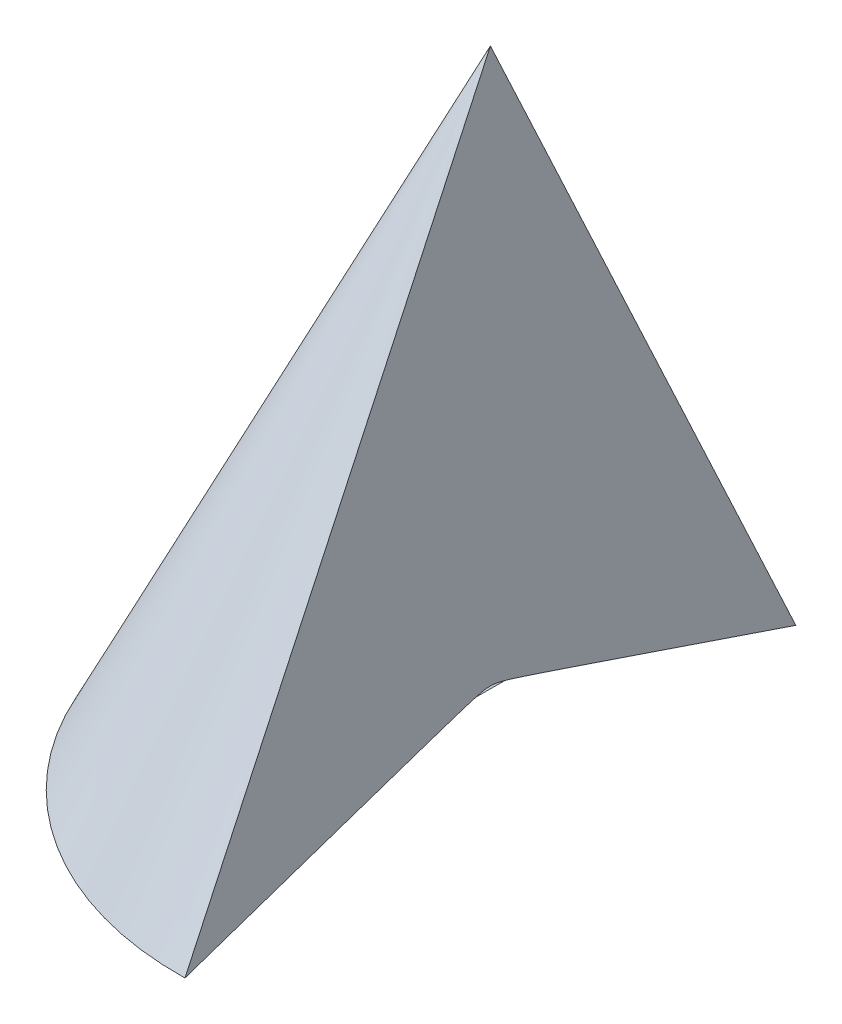
ISO-10303-21;
HEADER;
FILE_DESCRIPTION(('STEP AP214'),'2;1');
FILE_NAME('part.step','',(''),(''),'','','');
FILE_SCHEMA(('AUTOMOTIVE_DESIGN { 1 0 10303 214 1 1 1 1 }'));
ENDSEC;
DATA;
#1=APPLICATION_CONTEXT('core data for automotive mechanical design processes');
#2=APPLICATION_PROTOCOL_DEFINITION('international standard','automotive_design',2000,#1);
#3=PRODUCT_CONTEXT('',#1,'mechanical');
#4=PRODUCT('Part','Part','',(#3));
#5=PRODUCT_RELATED_PRODUCT_CATEGORY('part','',(#4));
#6=PRODUCT_DEFINITION_FORMATION('','',#4);
#7=PRODUCT_DEFINITION_CONTEXT('part definition',#1,'design');
#8=PRODUCT_DEFINITION('design','',#6,#7);
#9=PRODUCT_DEFINITION_SHAPE('','',#8);
#10=(LENGTH_UNIT() NAMED_UNIT(*) SI_UNIT(.MILLI.,.METRE.));
#11=(NAMED_UNIT(*) PLANE_ANGLE_UNIT() SI_UNIT($,.RADIAN.));
#12=(NAMED_UNIT(*) SI_UNIT($,.STERADIAN.) SOLID_ANGLE_UNIT());
#13=UNCERTAINTY_MEASURE_WITH_UNIT(LENGTH_MEASURE(1.E-05),#10,'distance_accuracy_value','');
#14=(GEOMETRIC_REPRESENTATION_CONTEXT(3) GLOBAL_UNCERTAINTY_ASSIGNED_CONTEXT((#13)) GLOBAL_UNIT_ASSIGNED_CONTEXT((#10,
#11,#12)) REPRESENTATION_CONTEXT('',''));
#15=CARTESIAN_POINT('',(0.,0.,0.));
#16=DIRECTION('',(0.,0.,1.));
#17=DIRECTION('',(1.,0.,0.));
#18=AXIS2_PLACEMENT_3D('',#15,#16,#17);
#19=CARTESIAN_POINT('',(-0.345388264296928,-18.896297547224,0.));
#20=DIRECTION('',(-0.0182750394746705,-0.999832997521186,0.));
#21=DIRECTION('',(0.999832997521186,-0.0182750394746705,0.));
#22=AXIS2_PLACEMENT_3D('',#19,#20,#21);
#23=CONICAL_SURFACE('',#22,55.7196314004557,1.24378548178926);
#24=CARTESIAN_POINT('',(0.,0.,0.));
#25=VERTEX_POINT('',#24);
#26=VERTEX_LOOP('',#25);
#27=FACE_BOUND('',#26,.T.);
#28=CARTESIAN_POINT('',(-0.345388264296928,-18.896297547224,0.));
#29=DIRECTION('',(-0.0182750394746705,-0.999832997521186,0.));
#30=DIRECTION('',(0.999832997521186,-0.0182750394746705,0.));
#31=AXIS2_PLACEMENT_3D('',#28,#29,#30);
#32=CIRCLE('',#31,55.7196314004557);
#33=CARTESIAN_POINT('',(1.8344866803659,-18.9361415019267,55.676960056091));
#34=VERTEX_POINT('',#33);
#35=CARTESIAN_POINT('',(1.8344866803659,-18.9361415019267,-55.676960056091));
#36=VERTEX_POINT('',#35);
#37=EDGE_CURVE('E59',#34,#36,#32,.T.);
#38=ORIENTED_EDGE('',*,*,#37,.T.);
#39=CARTESIAN_POINT('',(1.8344866803659,-57.3486806682432,-168.924511653932));
#40=CARTESIAN_POINT('',(1.8344866803659,-56.1488846711305,-165.387706260298));
#41=CARTESIAN_POINT('',(1.8344866803659,-54.9490924828589,-161.850899574579));
#42=CARTESIAN_POINT('',(1.8344866803659,-52.5494827497862,-154.777179475989));
#43=CARTESIAN_POINT('',(1.8344866803659,-51.3496652052696,-151.240266063022));
#44=CARTESIAN_POINT('',(1.8344866803659,-48.9431727661586,-144.146185585806));
#45=CARTESIAN_POINT('',(1.8344866803659,-47.7364979395491,-140.589018498495));
#46=CARTESIAN_POINT('',(1.8344866803659,-45.3231987305474,-133.474783641327));
#47=CARTESIAN_POINT('',(1.8344866803659,-44.1165743477142,-129.917715871619));
#48=CARTESIAN_POINT('',(1.8344866803659,-41.5992032850772,-122.496567514345));
#49=CARTESIAN_POINT('',(1.8344866803659,-40.2884583261761,-118.632486343021));
#50=CARTESIAN_POINT('',(1.8344866803659,-37.6668795245121,-110.903963293529));
#51=CARTESIAN_POINT('',(1.8344866803659,-36.3560456844723,-107.039521414438));
#52=CARTESIAN_POINT('',(1.8344866803659,-33.7421429339811,-99.3333939472332));
#53=CARTESIAN_POINT('',(1.8344866803659,-32.4390737809483,-95.4917084414033));
#54=CARTESIAN_POINT('',(1.8344866803659,-29.8334300657303,-87.8096056111936));
#55=CARTESIAN_POINT('',(1.8344866803659,-28.5308554841748,-83.9691882933841));
#56=CARTESIAN_POINT('',(1.8344866803659,-26.6457828258898,-78.411168852217));
#57=CARTESIAN_POINT('',(1.8344866803659,-26.0632500042988,-76.693578513027));
#58=CARTESIAN_POINT('',(1.8344866803659,-24.8982026043487,-73.2583811652422));
#59=CARTESIAN_POINT('',(1.8344866803659,-24.315688026107,-71.5407741566075));
#60=CARTESIAN_POINT('',(1.8344866803659,-23.1499807748147,-68.1034736927679));
#61=CARTESIAN_POINT('',(1.8344866803659,-22.5667881337742,-66.3837802267071));
#62=CARTESIAN_POINT('',(1.8344866803659,-21.4004479675787,-62.9444166415996));
#63=CARTESIAN_POINT('',(1.8344866803659,-20.8173004417513,-61.2247465227808));
#64=CARTESIAN_POINT('',(1.8344866803659,-19.6396227509247,-57.7516975838534));
#65=CARTESIAN_POINT('',(1.8344866803659,-19.0450934316333,-55.9983184769713));
#66=CARTESIAN_POINT('',(1.8344866803659,-17.8560483221721,-52.4914077001424));
#67=CARTESIAN_POINT('',(1.8344866803659,-17.2615325364327,-50.7378760286934));
#68=CARTESIAN_POINT('',(1.8344866803659,-16.0751587993582,-47.2383915945871));
#69=CARTESIAN_POINT('',(1.8344866803659,-15.4833005045609,-45.4924389483697));
#70=CARTESIAN_POINT('',(1.8344866803659,-14.2998610656257,-42.0009898062797));
#71=CARTESIAN_POINT('',(1.8344866803659,-13.7082798904323,-40.255493320934));
#72=CARTESIAN_POINT('',(1.8344866803659,-12.5605077070578,-36.8684075305115));
#73=CARTESIAN_POINT('',(1.8344866803659,-12.0043073981966,-35.2268213771852));
#74=CARTESIAN_POINT('',(1.8344866803659,-10.8915452322914,-31.9418834290317));
#75=CARTESIAN_POINT('',(1.8344866803659,-10.334983594303,-30.2985315599925));
#76=CARTESIAN_POINT('',(1.8344866803659,-9.4954419070454,-27.8187735139823));
#77=CARTESIAN_POINT('',(1.8344866803659,-9.21233429901166,-26.9824105239473));
#78=CARTESIAN_POINT('',(1.8344866803659,-8.64622282900986,-25.309600511561));
#79=CARTESIAN_POINT('',(1.8344866803659,-8.36321897326613,-24.4731534871032));
#80=CARTESIAN_POINT('',(1.8344866803659,-7.7984348369219,-22.8033509128362));
#81=CARTESIAN_POINT('',(1.8344866803659,-7.51665395704138,-21.9699955657342));
#82=CARTESIAN_POINT('',(1.8344866803659,-6.95336778078859,-20.3033736537516));
#83=CARTESIAN_POINT('',(1.8344866803659,-6.67186244123925,-19.470107103466));
#84=CARTESIAN_POINT('',(1.8344866803659,-6.12215032647128,-17.841905931166));
#85=CARTESIAN_POINT('',(1.8344866803659,-5.85392911075651,-17.0469761849158));
#86=CARTESIAN_POINT('',(1.8344866803659,-5.31772757410966,-15.4563991449005));
#87=CARTESIAN_POINT('',(1.8344866803659,-5.04974756483601,-14.6607517460274));
#88=CARTESIAN_POINT('',(1.8344866803659,-4.64627173815602,-13.4610662917757));
#89=CARTESIAN_POINT('',(1.8344866803659,-4.5105161859179,-13.0571155980092));
#90=CARTESIAN_POINT('',(1.8344866803659,-4.23924153686415,-12.2491267830978));
#91=CARTESIAN_POINT('',(1.8344866803659,-4.10372244431298,-11.8450886605209));
#92=CARTESIAN_POINT('',(1.8344866803659,-3.83336237329919,-11.0379749732396));
#93=CARTESIAN_POINT('',(1.8344866803659,-3.69852054940558,-10.6348996918121));
#94=CARTESIAN_POINT('',(1.8344866803659,-3.42928622379184,-9.8286289517244));
#95=CARTESIAN_POINT('',(1.8344866803659,-3.29489369267837,-9.42543350288273));
#96=CARTESIAN_POINT('',(1.8344866803659,-3.03248244453316,-8.63610240465802));
#97=CARTESIAN_POINT('',(1.8344866803659,-2.90443722764711,-8.24997557246096));
#98=CARTESIAN_POINT('',(1.8344866803659,-2.64917624742354,-7.47734186193978));
#99=CARTESIAN_POINT('',(1.8344866803659,-2.52196069693394,-7.09083491326735));
#100=CARTESIAN_POINT('',(1.8344866803659,-2.26757108668334,-6.31343109417491));
#101=CARTESIAN_POINT('',(1.8344866803659,-2.14041073454425,-5.92252972363981));
#102=CARTESIAN_POINT('',(1.8344866803659,-1.95148911154104,-5.33579043364415));
#103=CARTESIAN_POINT('',(1.8344866803659,-1.88884686142146,-5.14023641439325));
#104=CARTESIAN_POINT('',(1.8344866803659,-1.76436790082381,-4.74887240892809));
#105=CARTESIAN_POINT('',(1.8344866803659,-1.70253118795538,-4.55306242347529));
#106=CARTESIAN_POINT('',(1.8344866803659,-1.58213752519839,-4.16800034782879));
#107=CARTESIAN_POINT('',(1.8344866803659,-1.52354180118499,-3.97876040830553));
#108=CARTESIAN_POINT('',(1.8344866803659,-1.40783739844313,-3.5998289712902));
#109=CARTESIAN_POINT('',(1.8344866803659,-1.3507286924364,-3.41013748215125));
#110=CARTESIAN_POINT('',(1.8344866803659,-1.23849793104316,-3.02939614724901));
#111=CARTESIAN_POINT('',(1.8344866803659,-1.18338405488034,-2.83834387339489));
#112=CARTESIAN_POINT('',(1.8344866803659,-1.07657173643614,-2.45525921290713));
#113=CARTESIAN_POINT('',(1.8344866803659,-1.02487364858583,-2.2632267267842));
#114=CARTESIAN_POINT('',(1.8344866803659,-0.928031343347894,-1.88187080469717));
#115=CARTESIAN_POINT('',(1.8344866803659,-0.882770102757694,-1.69257790709622));
#116=CARTESIAN_POINT('',(1.8344866803659,-0.821453542421972,-1.40718759056024));
#117=CARTESIAN_POINT('',(1.8344866803659,-0.802108926077679,-1.31180580193573));
#118=CARTESIAN_POINT('',(1.8344866803659,-0.766248476397584,-1.12051840746296));
#119=CARTESIAN_POINT('',(1.8344866803659,-0.749732666605156,-1.02461279726193));
#120=CARTESIAN_POINT('',(1.8344866803659,-0.705794971790485,-0.737564509655973));
#121=CARTESIAN_POINT('',(1.8344866803659,-0.683622131817135,-0.545522516589417));
#122=CARTESIAN_POINT('',(1.8344866803659,-0.665092398140918,-0.256629299256788));
#123=CARTESIAN_POINT('',(1.8344866803659,-0.661369188193533,-0.160234620541625));
#124=CARTESIAN_POINT('',(1.8344866803659,-0.659100346061676,0.0326202567833365));
#125=CARTESIAN_POINT('',(1.8344866803659,-0.660554620024727,0.129080454173785));
#126=CARTESIAN_POINT('',(1.8344866803659,-0.668503307728492,0.321295579817073));
#127=CARTESIAN_POINT('',(1.8344866803659,-0.674972091148605,0.417051602150619));
#128=CARTESIAN_POINT('',(1.8344866803659,-0.692415156251004,0.608148551785522));
#129=CARTESIAN_POINT('',(1.8344866803659,-0.703389759523428,0.703489448967545));
#130=CARTESIAN_POINT('',(1.8344866803659,-0.742027805830815,0.988963818656927));
#131=CARTESIAN_POINT('',(1.8344866803659,-0.775392729325024,1.1783170540667));
#132=CARTESIAN_POINT('',(1.8344866803659,-0.852050547852075,1.55665767134898));
#133=CARTESIAN_POINT('',(1.8344866803659,-0.895430108928356,1.74562641610541));
#134=CARTESIAN_POINT('',(1.8344866803659,-0.988066085578386,2.12198178972957));
#135=CARTESIAN_POINT('',(1.8344866803659,-1.03731912444793,2.30936926195907));
#136=CARTESIAN_POINT('',(1.8344866803659,-1.14070199472914,2.68755781438007));
#137=CARTESIAN_POINT('',(1.8344866803659,-1.19491974834035,2.87833452801593));
#138=CARTESIAN_POINT('',(1.8344866803659,-1.30581501561996,3.25917383232224));
#139=CARTESIAN_POINT('',(1.8344866803659,-1.36249260450217,3.44923640096309));
#140=CARTESIAN_POINT('',(1.8344866803659,-1.47726640871431,3.82811804371395));
#141=CARTESIAN_POINT('',(1.8344866803659,-1.53535619797161,4.01693907252071));
#142=CARTESIAN_POINT('',(1.8344866803659,-1.65267367460009,4.39421948670965));
#143=CARTESIAN_POINT('',(1.8344866803659,-1.71190132352889,4.5826788840737));
#144=CARTESIAN_POINT('',(1.8344866803659,-1.89518929833138,5.16156594805983));
#145=CARTESIAN_POINT('',(1.8344866803659,-2.02057716783557,5.5515726540618));
#146=CARTESIAN_POINT('',(1.8344866803659,-2.27336611068459,6.33138164665254));
#147=CARTESIAN_POINT('',(1.8344866803659,-2.40076915636186,6.72118329054194));
#148=CARTESIAN_POINT('',(1.8344866803659,-2.6555050467717,7.49665303969533));
#149=CARTESIAN_POINT('',(1.8344866803659,-2.78282675464133,7.88232480486379));
#150=CARTESIAN_POINT('',(1.8344866803659,-3.03817544154164,8.65331320606043));
#151=CARTESIAN_POINT('',(1.8344866803659,-3.16620221050508,9.03862991175107));
#152=CARTESIAN_POINT('',(1.8344866803659,-3.42843333470726,9.82611380950976));
#153=CARTESIAN_POINT('',(1.8344866803659,-3.56266071341932,10.2282733322899));
#154=CARTESIAN_POINT('',(1.8344866803659,-3.83151890350913,11.0324919332948));
#155=CARTESIAN_POINT('',(1.8344866803659,-3.96614974521042,11.4345510013777));
#156=CARTESIAN_POINT('',(1.8344866803659,-4.37114233174841,12.6426022163903));
#157=CARTESIAN_POINT('',(1.8344866803659,-4.64193104945772,13.4484511971823));
#158=CARTESIAN_POINT('',(1.8344866803659,-5.18027954630628,15.0484002114153));
#159=CARTESIAN_POINT('',(1.8344866803659,-5.4478300820121,15.8425033574683));
#160=CARTESIAN_POINT('',(1.8344866803659,-5.98315495377473,17.4300295075399));
#161=CARTESIAN_POINT('',(1.8344866803659,-6.25092901171867,18.2234526053473));
#162=CARTESIAN_POINT('',(1.8344866803659,-6.7995569119737,19.8481321913233));
#163=CARTESIAN_POINT('',(1.8344866803659,-7.08042411312321,20.6793841675459));
#164=CARTESIAN_POINT('',(1.8344866803659,-7.64241937381272,22.3419728100714));
#165=CARTESIAN_POINT('',(1.8344866803659,-7.92354747225672,23.1733094632228));
#166=CARTESIAN_POINT('',(1.8344866803659,-8.48697041675699,24.8389356367379));
#167=CARTESIAN_POINT('',(1.8344866803659,-8.7692658081737,25.6732249726128));
#168=CARTESIAN_POINT('',(1.8344866803659,-9.33395554058288,27.3417236642291));
#169=CARTESIAN_POINT('',(1.8344866803659,-9.61634987592236,28.1759330218839));
#170=CARTESIAN_POINT('',(1.8344866803659,-10.1764103993795,29.8301023464428));
#171=CARTESIAN_POINT('',(1.8344866803659,-10.4540751266706,30.6500628079612));
#172=CARTESIAN_POINT('',(1.8344866803659,-11.009473969167,32.2899724071442));
#173=CARTESIAN_POINT('',(1.8344866803659,-11.2872080852474,33.1099215445124));
#174=CARTESIAN_POINT('',(1.8344866803659,-12.1199364474242,35.5681132108105));
#175=CARTESIAN_POINT('',(1.8344866803659,-12.6750084489587,37.2063293993698));
#176=CARTESIAN_POINT('',(1.8344866803659,-13.8201806075072,40.5856755579076));
#177=CARTESIAN_POINT('',(1.8344866803659,-14.4102896821467,42.3268025057739));
#178=CARTESIAN_POINT('',(1.8344866803659,-15.5907746990135,45.8094912886236));
#179=CARTESIAN_POINT('',(1.8344866803659,-16.1811506702429,47.5510531137763));
#180=CARTESIAN_POINT('',(1.8344866803659,-17.3644863221778,51.0415454308879));
#181=CARTESIAN_POINT('',(1.8344866803659,-17.9574463295974,52.7904758120834));
#182=CARTESIAN_POINT('',(1.8344866803659,-19.143380688944,56.2881904042923));
#183=CARTESIAN_POINT('',(1.8344866803659,-19.7363550367179,58.0369746167139));
#184=CARTESIAN_POINT('',(1.8344866803659,-20.9111252720089,61.5014338601668));
#185=CARTESIAN_POINT('',(1.8344866803659,-21.4929203425145,63.2171091682421));
#186=CARTESIAN_POINT('',(1.8344866803659,-22.6565545116233,66.6484817742215));
#187=CARTESIAN_POINT('',(1.8344866803659,-23.2383936108595,68.3641790719109));
#188=CARTESIAN_POINT('',(1.8344866803659,-24.4014130722239,71.7935454438034));
#189=CARTESIAN_POINT('',(1.8344866803659,-24.9825934036469,73.5072145284197));
#190=CARTESIAN_POINT('',(1.8344866803659,-26.1449721473881,76.9345365516576));
#191=CARTESIAN_POINT('',(1.8344866803659,-26.7261705595955,78.6481894903169));
#192=CARTESIAN_POINT('',(1.8344866803659,-28.6061277384183,84.1911178353617));
#193=CARTESIAN_POINT('',(1.8344866803659,-29.9049207431103,88.0203816294452));
#194=CARTESIAN_POINT('',(1.8344866803659,-32.5029880943351,95.6801407553441));
#195=CARTESIAN_POINT('',(1.8344866803659,-33.8022624595105,99.5106360808363));
#196=CARTESIAN_POINT('',(1.8344866803659,-36.4084427037084,107.193992688802));
#197=CARTESIAN_POINT('',(1.8344866803659,-37.7153488193245,111.046853891024));
#198=CARTESIAN_POINT('',(1.8344866803659,-40.3290753026697,118.752225733251));
#199=CARTESIAN_POINT('',(1.8344866803659,-41.6358956677706,122.604736374148));
#200=CARTESIAN_POINT('',(1.8344866803659,-44.146556212271,130.006101097389));
#201=CARTESIAN_POINT('',(1.8344866803659,-45.3503946979218,133.554955754279));
#202=CARTESIAN_POINT('',(1.8344866803659,-47.7581210371862,140.652761519382));
#203=CARTESIAN_POINT('',(1.8344866803659,-48.962008891227,144.201712627448));
#204=CARTESIAN_POINT('',(1.8344866803659,-51.3630390399814,151.279690511289));
#205=CARTESIAN_POINT('',(1.8344866803659,-52.5601812680292,154.808717309678));
#206=CARTESIAN_POINT('',(1.8344866803659,-54.9544412893901,161.866667052172));
#207=CARTESIAN_POINT('',(1.8344866803659,-56.1515590824273,165.39558999637));
#208=CARTESIAN_POINT('',(1.8344866803659,-57.3486806682432,168.924511653932));
#209=B_SPLINE_CURVE_WITH_KNOTS('',3,(#39,#40,#41,#42,#43,#44,#45,#46,#47,#48,#49,#50,#51,#52,
#53,#54,#55,#56,#57,#58,#59,#60,#61,#62,#63,#64,#65,#66,#67,#68,#69,#70,#71,#72,#73,#74,#75,#76,
#77,#78,#79,#80,#81,#82,#83,#84,#85,#86,#87,#88,#89,#90,#91,#92,#93,#94,#95,#96,#97,#98,#99,
#100,#101,#102,#103,#104,#105,#106,#107,#108,#109,#110,#111,#112,#113,#114,#115,#116,#117,#118,
#119,#120,#121,#122,#123,#124,#125,#126,#127,#128,#129,#130,#131,#132,#133,#134,#135,#136,#137,
#138,#139,#140,#141,#142,#143,#144,#145,#146,#147,#148,#149,#150,#151,#152,#153,#154,#155,#156,
#157,#158,#159,#160,#161,#162,#163,#164,#165,#166,#167,#168,#169,#170,#171,#172,#173,#174,#175,
#176,#177,#178,#179,#180,#181,#182,#183,#184,#185,#186,#187,#188,#189,#190,#191,#192,#193,#194,
#195,#196,#197,#198,#199,#200,#201,#202,#203,#204,#205,#206,#207,#208),.UNSPECIFIED.,.F.,.F.,(4,
2,2,2,2,2,2,2,2,2,2,2,2,2,2,2,2,2,2,2,2,2,2,2,2,2,2,2,2,2,2,2,2,2,2,2,2,2,2,2,2,2,2,2,2,2,2,2,2,
2,2,2,2,2,2,2,2,2,2,2,2,2,2,2,2,2,2,2,2,2,2,2,2,2,2,2,2,2,2,2,2,2,2,2,4),(0.,11.2043083429675,
22.4089443334072,33.6777293796037,44.9461836513727,57.1872040667914,69.4293349080006,
81.5993320601462,93.765249675312,99.2063111115041,104.647402328153,110.095074625666,
115.542637125101,121.096935517089,126.651654327681,132.182280144899,137.711343025765,
142.911100218687,148.116222283365,150.76516106832,153.414238870092,156.053355064108,
158.691954189768,161.208837774155,163.727530174964,165.005986845741,166.284466339509,
167.559561447736,168.834571437789,170.054982740271,171.275695704424,172.508882564825,
173.124908006525,173.740931619815,174.335239522365,174.929536515076,175.526043945182,
176.122613173562,176.706354451431,176.998284964928,177.290217907963,177.869265352082,
178.158541574994,178.44781255421,178.735614673147,179.023437336717,179.599777118485,
180.181304999976,180.762500154268,181.357471269737,181.952460590335,182.545119428843,
183.13775827957,184.366749494182,185.597028838193,186.81546165825,188.033549225411,
189.305454361493,190.577457617204,193.127843655953,195.641734524106,198.153906494901,
200.786167103157,203.418919017505,206.061184030923,208.703316935451,211.300410640965,
213.897538946055,219.086634701035,224.601865056111,230.118588030504,235.658735268983,
241.19848103755,246.633390916913,252.068405690533,257.497023450239,262.925612760144,
275.056198906079,287.190747716205,299.396192703723,311.600559108487,322.842995155737,
334.085752797544,345.265404711667,356.444738028465),.UNSPECIFIED.);
#210=EDGE_CURVE('E56',#36,#34,#209,.T.);
#211=ORIENTED_EDGE('',*,*,#210,.T.);
#212=EDGE_LOOP('',(#38,#211));
#213=FACE_BOUND('',#212,.T.);
#214=ADVANCED_FACE('F33',(#27,#213),#23,.F.);
#215=CARTESIAN_POINT('',(1.8344866803659,100.365327204088,0.));
#216=DIRECTION('',(-0.0182750394746705,-0.999832997521186,0.));
#217=DIRECTION('',(0.999832997521186,-0.0182750394746705,0.));
#218=AXIS2_PLACEMENT_3D('',#215,#216,#217);
#219=CONICAL_SURFACE('',#218,0.,0.437005111635416);
#220=DIRECTION('',(0.,0.906174578344793,-0.422903811240377));
#221=VECTOR('',#220,1.);
#222=CARTESIAN_POINT('',(1.8344866803659,100.365327204088,0.));
#223=LINE('',#222,#221);
#224=CARTESIAN_POINT('',(1.8344866803659,100.365327204088,0.));
#225=VERTEX_POINT('',#224);
#226=EDGE_CURVE('E41',#34,#225,#223,.T.);
#227=ORIENTED_EDGE('',*,*,#226,.T.);
#228=DIRECTION('',(0.,-0.906174578344793,-0.422903811240377));
#229=VECTOR('',#228,1.);
#230=CARTESIAN_POINT('',(1.8344866803659,100.365327204088,0.));
#231=LINE('',#230,#229);
#232=EDGE_CURVE('E11',#225,#36,#231,.T.);
#233=ORIENTED_EDGE('',*,*,#232,.T.);
#234=ORIENTED_EDGE('',*,*,#37,.F.);
#235=EDGE_LOOP('',(#227,#233,#234));
#236=FACE_BOUND('',#235,.T.);
#237=ADVANCED_FACE('F63',(#236),#219,.T.);
#238=CARTESIAN_POINT('',(1.8344866803659,100.365327204088,-55.7196314004557));
#239=DIRECTION('',(-1.,0.,0.));
#240=DIRECTION('',(0.,0.,1.));
#241=AXIS2_PLACEMENT_3D('',#238,#239,#240);
#242=PLANE('',#241);
#243=ORIENTED_EDGE('',*,*,#232,.F.);
#244=ORIENTED_EDGE('',*,*,#226,.F.);
#245=ORIENTED_EDGE('',*,*,#210,.F.);
#246=EDGE_LOOP('',(#243,#244,#245));
#247=FACE_BOUND('',#246,.T.);
#248=ADVANCED_FACE('F55',(#247),#242,.F.);
#249=CLOSED_SHELL('',(#214,#237,#248));
#250=MANIFOLD_SOLID_BREP('B2',#249);
#251=ADVANCED_BREP_SHAPE_REPRESENTATION('',(#18,#250),#14);
#252=SHAPE_DEFINITION_REPRESENTATION(#9,#251);
ENDSEC;
END-ISO-10303-21;
